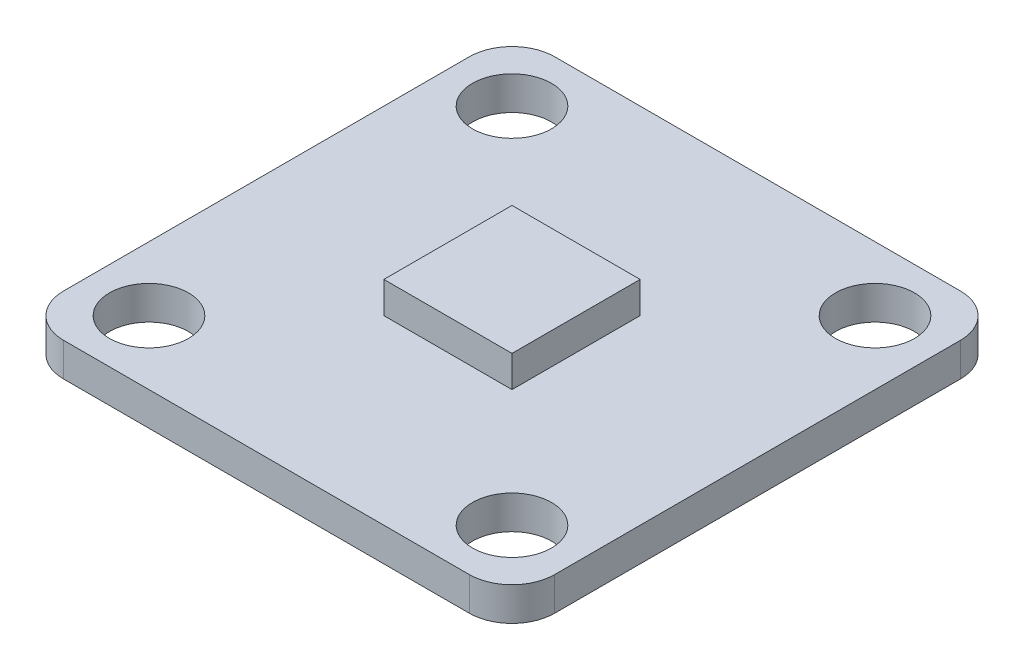
ISO-10303-21;
HEADER;
FILE_DESCRIPTION(('STEP AP214'),'2;1');
FILE_NAME('part.step','',(''),(''),'','','');
FILE_SCHEMA(('AUTOMOTIVE_DESIGN { 1 0 10303 214 1 1 1 1 }'));
ENDSEC;
DATA;
#1=APPLICATION_CONTEXT('core data for automotive mechanical design processes');
#2=APPLICATION_PROTOCOL_DEFINITION('international standard','automotive_design',2000,#1);
#3=PRODUCT_CONTEXT('',#1,'mechanical');
#4=PRODUCT('Part','Part','',(#3));
#5=PRODUCT_RELATED_PRODUCT_CATEGORY('part','',(#4));
#6=PRODUCT_DEFINITION_FORMATION('','',#4);
#7=PRODUCT_DEFINITION_CONTEXT('part definition',#1,'design');
#8=PRODUCT_DEFINITION('design','',#6,#7);
#9=PRODUCT_DEFINITION_SHAPE('','',#8);
#10=(LENGTH_UNIT() NAMED_UNIT(*) SI_UNIT(.MILLI.,.METRE.));
#11=(NAMED_UNIT(*) PLANE_ANGLE_UNIT() SI_UNIT($,.RADIAN.));
#12=(NAMED_UNIT(*) SI_UNIT($,.STERADIAN.) SOLID_ANGLE_UNIT());
#13=UNCERTAINTY_MEASURE_WITH_UNIT(LENGTH_MEASURE(1.E-05),#10,'distance_accuracy_value','');
#14=(GEOMETRIC_REPRESENTATION_CONTEXT(3) GLOBAL_UNCERTAINTY_ASSIGNED_CONTEXT((#13)) GLOBAL_UNIT_ASSIGNED_CONTEXT((#10,
#11,#12)) REPRESENTATION_CONTEXT('',''));
#15=CARTESIAN_POINT('',(0.,0.,0.));
#16=DIRECTION('',(0.,0.,1.));
#17=DIRECTION('',(1.,0.,0.));
#18=AXIS2_PLACEMENT_3D('',#15,#16,#17);
#19=CARTESIAN_POINT('',(0.,1.57,0.));
#20=DIRECTION('',(0.,1.,0.));
#21=DIRECTION('',(0.,0.,1.));
#22=AXIS2_PLACEMENT_3D('',#19,#20,#21);
#23=PLANE('',#22);
#24=CARTESIAN_POINT('',(-8.5,1.57,8.5));
#25=DIRECTION('',(0.,1.,0.));
#26=DIRECTION('',(0.,0.,1.));
#27=AXIS2_PLACEMENT_3D('',#24,#25,#26);
#28=CIRCLE('',#27,1.85);
#29=CARTESIAN_POINT('',(-8.5,1.57,10.35));
#30=VERTEX_POINT('',#29);
#31=EDGE_CURVE('E179',#30,#30,#28,.T.);
#32=ORIENTED_EDGE('',*,*,#31,.F.);
#33=EDGE_LOOP('',(#32));
#34=FACE_BOUND('',#33,.T.);
#35=CARTESIAN_POINT('',(8.5,1.57,8.5));
#36=DIRECTION('',(0.,1.,0.));
#37=DIRECTION('',(0.,0.,1.));
#38=AXIS2_PLACEMENT_3D('',#35,#36,#37);
#39=CIRCLE('',#38,1.85);
#40=CARTESIAN_POINT('',(8.5,1.57,10.35));
#41=VERTEX_POINT('',#40);
#42=EDGE_CURVE('E219',#41,#41,#39,.T.);
#43=ORIENTED_EDGE('',*,*,#42,.F.);
#44=EDGE_LOOP('',(#43));
#45=FACE_BOUND('',#44,.T.);
#46=CARTESIAN_POINT('',(8.5,1.57,-8.5));
#47=DIRECTION('',(0.,1.,0.));
#48=DIRECTION('',(0.,0.,1.));
#49=AXIS2_PLACEMENT_3D('',#46,#47,#48);
#50=CIRCLE('',#49,1.85);
#51=CARTESIAN_POINT('',(8.5,1.57,-6.65));
#52=VERTEX_POINT('',#51);
#53=EDGE_CURVE('E216',#52,#52,#50,.T.);
#54=ORIENTED_EDGE('',*,*,#53,.F.);
#55=EDGE_LOOP('',(#54));
#56=FACE_BOUND('',#55,.T.);
#57=CARTESIAN_POINT('',(-8.5,1.57,-8.5));
#58=DIRECTION('',(0.,1.,0.));
#59=DIRECTION('',(0.,0.,1.));
#60=AXIS2_PLACEMENT_3D('',#57,#58,#59);
#61=CIRCLE('',#60,1.85);
#62=CARTESIAN_POINT('',(-8.5,1.57,-6.65));
#63=VERTEX_POINT('',#62);
#64=EDGE_CURVE('E213',#63,#63,#61,.T.);
#65=ORIENTED_EDGE('',*,*,#64,.F.);
#66=EDGE_LOOP('',(#65));
#67=FACE_BOUND('',#66,.T.);
#68=CARTESIAN_POINT('',(-9.5,1.57,-9.5));
#69=DIRECTION('',(0.,1.,0.));
#70=DIRECTION('',(0.,0.,1.));
#71=AXIS2_PLACEMENT_3D('',#68,#69,#70);
#72=CIRCLE('',#71,2.);
#73=CARTESIAN_POINT('',(-11.5,1.57,-9.49999999999999));
#74=VERTEX_POINT('',#73);
#75=CARTESIAN_POINT('',(-9.49999999999999,1.57,-11.5));
#76=VERTEX_POINT('',#75);
#77=EDGE_CURVE('E209',#74,#76,#72,.F.);
#78=ORIENTED_EDGE('',*,*,#77,.F.);
#79=DIRECTION('',(0.,0.,-1.));
#80=VECTOR('',#79,1.);
#81=CARTESIAN_POINT('',(-11.5,1.57,0.));
#82=LINE('',#81,#80);
#83=CARTESIAN_POINT('',(-11.5,1.57,9.49999999999999));
#84=VERTEX_POINT('',#83);
#85=EDGE_CURVE('E207',#84,#74,#82,.T.);
#86=ORIENTED_EDGE('',*,*,#85,.F.);
#87=CARTESIAN_POINT('',(-9.5,1.57,9.5));
#88=DIRECTION('',(0.,1.,0.));
#89=DIRECTION('',(0.,0.,1.));
#90=AXIS2_PLACEMENT_3D('',#87,#88,#89);
#91=CIRCLE('',#90,2.);
#92=CARTESIAN_POINT('',(-9.49999999999999,1.57,11.5));
#93=VERTEX_POINT('',#92);
#94=EDGE_CURVE('E193',#93,#84,#91,.F.);
#95=ORIENTED_EDGE('',*,*,#94,.F.);
#96=DIRECTION('',(1.,0.,0.));
#97=VECTOR('',#96,1.);
#98=CARTESIAN_POINT('',(0.,1.57,11.5));
#99=LINE('',#98,#97);
#100=CARTESIAN_POINT('',(9.49999999999998,1.57,11.5));
#101=VERTEX_POINT('',#100);
#102=EDGE_CURVE('E205',#93,#101,#99,.T.);
#103=ORIENTED_EDGE('',*,*,#102,.T.);
#104=CARTESIAN_POINT('',(9.5,1.57,9.5));
#105=DIRECTION('',(0.,1.,0.));
#106=DIRECTION('',(0.,0.,1.));
#107=AXIS2_PLACEMENT_3D('',#104,#105,#106);
#108=CIRCLE('',#107,2.);
#109=CARTESIAN_POINT('',(11.5,1.57,9.49999999999999));
#110=VERTEX_POINT('',#109);
#111=EDGE_CURVE('E125',#101,#110,#108,.T.);
#112=ORIENTED_EDGE('',*,*,#111,.T.);
#113=DIRECTION('',(0.,0.,-1.));
#114=VECTOR('',#113,1.);
#115=CARTESIAN_POINT('',(11.5,1.57,0.));
#116=LINE('',#115,#114);
#117=CARTESIAN_POINT('',(11.5,1.57,-9.49999999999999));
#118=VERTEX_POINT('',#117);
#119=EDGE_CURVE('E118',#110,#118,#116,.T.);
#120=ORIENTED_EDGE('',*,*,#119,.T.);
#121=CARTESIAN_POINT('',(9.5,1.57,-9.5));
#122=DIRECTION('',(0.,1.,0.));
#123=DIRECTION('',(0.,0.,1.));
#124=AXIS2_PLACEMENT_3D('',#121,#122,#123);
#125=CIRCLE('',#124,2.);
#126=CARTESIAN_POINT('',(9.49999999999998,1.57,-11.5));
#127=VERTEX_POINT('',#126);
#128=EDGE_CURVE('E123',#127,#118,#125,.F.);
#129=ORIENTED_EDGE('',*,*,#128,.F.);
#130=DIRECTION('',(1.,0.,0.));
#131=VECTOR('',#130,1.);
#132=CARTESIAN_POINT('',(0.,1.57,-11.5));
#133=LINE('',#132,#131);
#134=EDGE_CURVE('E141',#76,#127,#133,.T.);
#135=ORIENTED_EDGE('',*,*,#134,.F.);
#136=EDGE_LOOP('',(#78,#86,#95,#103,#112,#120,#129,#135));
#137=FACE_BOUND('',#136,.T.);
#138=DIRECTION('',(0.,0.,1.));
#139=VECTOR('',#138,1.);
#140=CARTESIAN_POINT('',(-3.,1.57,0.));
#141=LINE('',#140,#139);
#142=CARTESIAN_POINT('',(-3.,1.57,-3.));
#143=VERTEX_POINT('',#142);
#144=CARTESIAN_POINT('',(-3.,1.57,3.));
#145=VERTEX_POINT('',#144);
#146=EDGE_CURVE('E239',#143,#145,#141,.T.);
#147=ORIENTED_EDGE('',*,*,#146,.F.);
#148=DIRECTION('',(-1.,0.,0.));
#149=VECTOR('',#148,1.);
#150=CARTESIAN_POINT('',(0.,1.57,-3.));
#151=LINE('',#150,#149);
#152=CARTESIAN_POINT('',(3.,1.57,-3.));
#153=VERTEX_POINT('',#152);
#154=EDGE_CURVE('E242',#153,#143,#151,.T.);
#155=ORIENTED_EDGE('',*,*,#154,.F.);
#156=DIRECTION('',(0.,0.,-1.));
#157=VECTOR('',#156,1.);
#158=CARTESIAN_POINT('',(3.,1.57,0.));
#159=LINE('',#158,#157);
#160=CARTESIAN_POINT('',(3.,1.57,3.));
#161=VERTEX_POINT('',#160);
#162=EDGE_CURVE('E234',#161,#153,#159,.T.);
#163=ORIENTED_EDGE('',*,*,#162,.F.);
#164=DIRECTION('',(1.,0.,0.));
#165=VECTOR('',#164,1.);
#166=CARTESIAN_POINT('',(0.,1.57,3.));
#167=LINE('',#166,#165);
#168=EDGE_CURVE('E237',#145,#161,#167,.T.);
#169=ORIENTED_EDGE('',*,*,#168,.F.);
#170=EDGE_LOOP('',(#147,#155,#163,#169));
#171=FACE_BOUND('',#170,.T.);
#172=ADVANCED_FACE('F40',(#34,#45,#56,#67,#137,#171),#23,.T.);
#173=CARTESIAN_POINT('',(-9.5,1.57,-9.5));
#174=DIRECTION('',(0.,-1.,0.));
#175=DIRECTION('',(0.,0.,-1.));
#176=AXIS2_PLACEMENT_3D('',#173,#174,#175);
#177=CYLINDRICAL_SURFACE('',#176,2.);
#178=CARTESIAN_POINT('',(-9.5,0.,-9.5));
#179=DIRECTION('',(0.,1.,0.));
#180=DIRECTION('',(0.,0.,1.));
#181=AXIS2_PLACEMENT_3D('',#178,#179,#180);
#182=CIRCLE('',#181,2.);
#183=CARTESIAN_POINT('',(-11.5,0.,-9.49999999999999));
#184=VERTEX_POINT('',#183);
#185=CARTESIAN_POINT('',(-9.49999999999999,0.,-11.5));
#186=VERTEX_POINT('',#185);
#187=EDGE_CURVE('E159',#184,#186,#182,.F.);
#188=ORIENTED_EDGE('',*,*,#187,.F.);
#189=DIRECTION('',(0.,-1.,0.));
#190=VECTOR('',#189,1.);
#191=CARTESIAN_POINT('',(-11.5,1.57,-9.49999999999999));
#192=LINE('',#191,#190);
#193=EDGE_CURVE('E11',#74,#184,#192,.T.);
#194=ORIENTED_EDGE('',*,*,#193,.F.);
#195=ORIENTED_EDGE('',*,*,#77,.T.);
#196=DIRECTION('',(0.,-1.,0.));
#197=VECTOR('',#196,1.);
#198=CARTESIAN_POINT('',(-9.49999999999999,1.57,-11.5));
#199=LINE('',#198,#197);
#200=EDGE_CURVE('E64',#76,#186,#199,.T.);
#201=ORIENTED_EDGE('',*,*,#200,.T.);
#202=EDGE_LOOP('',(#188,#194,#195,#201));
#203=FACE_BOUND('',#202,.T.);
#204=ADVANCED_FACE('F284',(#203),#177,.T.);
#205=CARTESIAN_POINT('',(-11.5,1.57,0.));
#206=DIRECTION('',(-1.,0.,0.));
#207=DIRECTION('',(0.,0.,1.));
#208=AXIS2_PLACEMENT_3D('',#205,#206,#207);
#209=PLANE('',#208);
#210=DIRECTION('',(0.,0.,-1.));
#211=VECTOR('',#210,1.);
#212=CARTESIAN_POINT('',(-11.5,0.,0.));
#213=LINE('',#212,#211);
#214=CARTESIAN_POINT('',(-11.5,0.,9.49999999999999));
#215=VERTEX_POINT('',#214);
#216=EDGE_CURVE('E161',#215,#184,#213,.T.);
#217=ORIENTED_EDGE('',*,*,#216,.F.);
#218=DIRECTION('',(0.,-1.,0.));
#219=VECTOR('',#218,1.);
#220=CARTESIAN_POINT('',(-11.5,1.57,9.49999999999999));
#221=LINE('',#220,#219);
#222=EDGE_CURVE('E48',#84,#215,#221,.T.);
#223=ORIENTED_EDGE('',*,*,#222,.F.);
#224=ORIENTED_EDGE('',*,*,#85,.T.);
#225=ORIENTED_EDGE('',*,*,#193,.T.);
#226=EDGE_LOOP('',(#217,#223,#224,#225));
#227=FACE_BOUND('',#226,.T.);
#228=ADVANCED_FACE('F197',(#227),#209,.T.);
#229=CARTESIAN_POINT('',(-9.5,1.57,9.5));
#230=DIRECTION('',(0.,-1.,0.));
#231=DIRECTION('',(0.,0.,-1.));
#232=AXIS2_PLACEMENT_3D('',#229,#230,#231);
#233=CYLINDRICAL_SURFACE('',#232,2.);
#234=CARTESIAN_POINT('',(-9.5,0.,9.5));
#235=DIRECTION('',(0.,1.,0.));
#236=DIRECTION('',(0.,0.,1.));
#237=AXIS2_PLACEMENT_3D('',#234,#235,#236);
#238=CIRCLE('',#237,2.);
#239=CARTESIAN_POINT('',(-9.49999999999999,0.,11.5));
#240=VERTEX_POINT('',#239);
#241=EDGE_CURVE('E164',#240,#215,#238,.F.);
#242=ORIENTED_EDGE('',*,*,#241,.F.);
#243=DIRECTION('',(0.,-1.,0.));
#244=VECTOR('',#243,1.);
#245=CARTESIAN_POINT('',(-9.49999999999999,1.57,11.5));
#246=LINE('',#245,#244);
#247=EDGE_CURVE('E186',#93,#240,#246,.T.);
#248=ORIENTED_EDGE('',*,*,#247,.F.);
#249=ORIENTED_EDGE('',*,*,#94,.T.);
#250=ORIENTED_EDGE('',*,*,#222,.T.);
#251=EDGE_LOOP('',(#242,#248,#249,#250));
#252=FACE_BOUND('',#251,.T.);
#253=ADVANCED_FACE('F191',(#252),#233,.T.);
#254=CARTESIAN_POINT('',(0.,1.57,11.5));
#255=DIRECTION('',(0.,0.,-1.));
#256=DIRECTION('',(-1.,0.,0.));
#257=AXIS2_PLACEMENT_3D('',#254,#255,#256);
#258=PLANE('',#257);
#259=DIRECTION('',(1.,0.,0.));
#260=VECTOR('',#259,1.);
#261=CARTESIAN_POINT('',(0.,0.,11.5));
#262=LINE('',#261,#260);
#263=CARTESIAN_POINT('',(9.49999999999998,0.,11.5));
#264=VERTEX_POINT('',#263);
#265=EDGE_CURVE('E167',#240,#264,#262,.T.);
#266=ORIENTED_EDGE('',*,*,#265,.T.);
#267=DIRECTION('',(0.,-1.,0.));
#268=VECTOR('',#267,1.);
#269=CARTESIAN_POINT('',(9.49999999999998,1.57,11.5));
#270=LINE('',#269,#268);
#271=EDGE_CURVE('E183',#101,#264,#270,.T.);
#272=ORIENTED_EDGE('',*,*,#271,.F.);
#273=ORIENTED_EDGE('',*,*,#102,.F.);
#274=ORIENTED_EDGE('',*,*,#247,.T.);
#275=EDGE_LOOP('',(#266,#272,#273,#274));
#276=FACE_BOUND('',#275,.T.);
#277=ADVANCED_FACE('F203',(#276),#258,.F.);
#278=CARTESIAN_POINT('',(9.5,1.57,9.5));
#279=DIRECTION('',(0.,-1.,0.));
#280=DIRECTION('',(0.,0.,-1.));
#281=AXIS2_PLACEMENT_3D('',#278,#279,#280);
#282=CYLINDRICAL_SURFACE('',#281,2.);
#283=CARTESIAN_POINT('',(9.5,0.,9.5));
#284=DIRECTION('',(0.,1.,0.));
#285=DIRECTION('',(0.,0.,1.));
#286=AXIS2_PLACEMENT_3D('',#283,#284,#285);
#287=CIRCLE('',#286,2.);
#288=CARTESIAN_POINT('',(11.5,0.,9.49999999999999));
#289=VERTEX_POINT('',#288);
#290=EDGE_CURVE('E170',#264,#289,#287,.T.);
#291=ORIENTED_EDGE('',*,*,#290,.T.);
#292=DIRECTION('',(0.,-1.,0.));
#293=VECTOR('',#292,1.);
#294=CARTESIAN_POINT('',(11.5,1.57,9.49999999999999));
#295=LINE('',#294,#293);
#296=EDGE_CURVE('E137',#110,#289,#295,.T.);
#297=ORIENTED_EDGE('',*,*,#296,.F.);
#298=ORIENTED_EDGE('',*,*,#111,.F.);
#299=ORIENTED_EDGE('',*,*,#271,.T.);
#300=EDGE_LOOP('',(#291,#297,#298,#299));
#301=FACE_BOUND('',#300,.T.);
#302=ADVANCED_FACE('F307',(#301),#282,.T.);
#303=CARTESIAN_POINT('',(11.5,1.57,0.));
#304=DIRECTION('',(-1.,0.,0.));
#305=DIRECTION('',(0.,0.,1.));
#306=AXIS2_PLACEMENT_3D('',#303,#304,#305);
#307=PLANE('',#306);
#308=DIRECTION('',(0.,0.,-1.));
#309=VECTOR('',#308,1.);
#310=CARTESIAN_POINT('',(11.5,0.,0.));
#311=LINE('',#310,#309);
#312=CARTESIAN_POINT('',(11.5,0.,-9.49999999999999));
#313=VERTEX_POINT('',#312);
#314=EDGE_CURVE('E133',#289,#313,#311,.T.);
#315=ORIENTED_EDGE('',*,*,#314,.T.);
#316=DIRECTION('',(0.,-1.,0.));
#317=VECTOR('',#316,1.);
#318=CARTESIAN_POINT('',(11.5,1.57,-9.49999999999999));
#319=LINE('',#318,#317);
#320=EDGE_CURVE('E131',#118,#313,#319,.T.);
#321=ORIENTED_EDGE('',*,*,#320,.F.);
#322=ORIENTED_EDGE('',*,*,#119,.F.);
#323=ORIENTED_EDGE('',*,*,#296,.T.);
#324=EDGE_LOOP('',(#315,#321,#322,#323));
#325=FACE_BOUND('',#324,.T.);
#326=ADVANCED_FACE('F132',(#325),#307,.F.);
#327=CARTESIAN_POINT('',(9.5,1.57,-9.5));
#328=DIRECTION('',(0.,-1.,0.));
#329=DIRECTION('',(0.,0.,-1.));
#330=AXIS2_PLACEMENT_3D('',#327,#328,#329);
#331=CYLINDRICAL_SURFACE('',#330,2.);
#332=CARTESIAN_POINT('',(9.5,0.,-9.5));
#333=DIRECTION('',(0.,1.,0.));
#334=DIRECTION('',(0.,0.,1.));
#335=AXIS2_PLACEMENT_3D('',#332,#333,#334);
#336=CIRCLE('',#335,2.);
#337=CARTESIAN_POINT('',(9.49999999999998,0.,-11.5));
#338=VERTEX_POINT('',#337);
#339=EDGE_CURVE('E174',#338,#313,#336,.F.);
#340=ORIENTED_EDGE('',*,*,#339,.F.);
#341=DIRECTION('',(0.,-1.,0.));
#342=VECTOR('',#341,1.);
#343=CARTESIAN_POINT('',(9.49999999999998,1.57,-11.5));
#344=LINE('',#343,#342);
#345=EDGE_CURVE('E138',#127,#338,#344,.T.);
#346=ORIENTED_EDGE('',*,*,#345,.F.);
#347=ORIENTED_EDGE('',*,*,#128,.T.);
#348=ORIENTED_EDGE('',*,*,#320,.T.);
#349=EDGE_LOOP('',(#340,#346,#347,#348));
#350=FACE_BOUND('',#349,.T.);
#351=ADVANCED_FACE('F140',(#350),#331,.T.);
#352=CARTESIAN_POINT('',(-8.5,1.57,-8.5));
#353=DIRECTION('',(0.,-1.,0.));
#354=DIRECTION('',(0.,0.,-1.));
#355=AXIS2_PLACEMENT_3D('',#352,#353,#354);
#356=CYLINDRICAL_SURFACE('',#355,1.85);
#357=ORIENTED_EDGE('',*,*,#64,.T.);
#358=EDGE_LOOP('',(#357));
#359=FACE_BOUND('',#358,.T.);
#360=CARTESIAN_POINT('',(-8.5,0.,-8.5));
#361=DIRECTION('',(0.,1.,0.));
#362=DIRECTION('',(0.,0.,1.));
#363=AXIS2_PLACEMENT_3D('',#360,#361,#362);
#364=CIRCLE('',#363,1.85);
#365=CARTESIAN_POINT('',(-8.5,0.,-6.65));
#366=VERTEX_POINT('',#365);
#367=EDGE_CURVE('E156',#366,#366,#364,.T.);
#368=ORIENTED_EDGE('',*,*,#367,.F.);
#369=EDGE_LOOP('',(#368));
#370=FACE_BOUND('',#369,.T.);
#371=ADVANCED_FACE('F304',(#359,#370),#356,.F.);
#372=CARTESIAN_POINT('',(8.5,1.57,-8.5));
#373=DIRECTION('',(0.,-1.,0.));
#374=DIRECTION('',(0.,0.,-1.));
#375=AXIS2_PLACEMENT_3D('',#372,#373,#374);
#376=CYLINDRICAL_SURFACE('',#375,1.85);
#377=ORIENTED_EDGE('',*,*,#53,.T.);
#378=EDGE_LOOP('',(#377));
#379=FACE_BOUND('',#378,.T.);
#380=CARTESIAN_POINT('',(8.5,0.,-8.5));
#381=DIRECTION('',(0.,1.,0.));
#382=DIRECTION('',(0.,0.,1.));
#383=AXIS2_PLACEMENT_3D('',#380,#381,#382);
#384=CIRCLE('',#383,1.85);
#385=CARTESIAN_POINT('',(8.5,0.,-6.65));
#386=VERTEX_POINT('',#385);
#387=EDGE_CURVE('E153',#386,#386,#384,.T.);
#388=ORIENTED_EDGE('',*,*,#387,.F.);
#389=EDGE_LOOP('',(#388));
#390=FACE_BOUND('',#389,.T.);
#391=ADVANCED_FACE('F319',(#379,#390),#376,.F.);
#392=CARTESIAN_POINT('',(8.5,1.57,8.5));
#393=DIRECTION('',(0.,-1.,0.));
#394=DIRECTION('',(0.,0.,-1.));
#395=AXIS2_PLACEMENT_3D('',#392,#393,#394);
#396=CYLINDRICAL_SURFACE('',#395,1.85);
#397=ORIENTED_EDGE('',*,*,#42,.T.);
#398=EDGE_LOOP('',(#397));
#399=FACE_BOUND('',#398,.T.);
#400=CARTESIAN_POINT('',(8.5,0.,8.5));
#401=DIRECTION('',(0.,1.,0.));
#402=DIRECTION('',(0.,0.,1.));
#403=AXIS2_PLACEMENT_3D('',#400,#401,#402);
#404=CIRCLE('',#403,1.85);
#405=CARTESIAN_POINT('',(8.5,0.,10.35));
#406=VERTEX_POINT('',#405);
#407=EDGE_CURVE('E149',#406,#406,#404,.T.);
#408=ORIENTED_EDGE('',*,*,#407,.F.);
#409=EDGE_LOOP('',(#408));
#410=FACE_BOUND('',#409,.T.);
#411=ADVANCED_FACE('F322',(#399,#410),#396,.F.);
#412=CARTESIAN_POINT('',(-8.5,1.57,8.5));
#413=DIRECTION('',(0.,-1.,0.));
#414=DIRECTION('',(0.,0.,-1.));
#415=AXIS2_PLACEMENT_3D('',#412,#413,#414);
#416=CYLINDRICAL_SURFACE('',#415,1.85);
#417=ORIENTED_EDGE('',*,*,#31,.T.);
#418=EDGE_LOOP('',(#417));
#419=FACE_BOUND('',#418,.T.);
#420=CARTESIAN_POINT('',(-8.5,0.,8.5));
#421=DIRECTION('',(0.,1.,0.));
#422=DIRECTION('',(0.,0.,1.));
#423=AXIS2_PLACEMENT_3D('',#420,#421,#422);
#424=CIRCLE('',#423,1.85);
#425=CARTESIAN_POINT('',(-8.5,0.,10.35));
#426=VERTEX_POINT('',#425);
#427=EDGE_CURVE('E146',#426,#426,#424,.T.);
#428=ORIENTED_EDGE('',*,*,#427,.F.);
#429=EDGE_LOOP('',(#428));
#430=FACE_BOUND('',#429,.T.);
#431=ADVANCED_FACE('F42',(#419,#430),#416,.F.);
#432=CARTESIAN_POINT('',(0.,1.57,-11.5));
#433=DIRECTION('',(0.,0.,-1.));
#434=DIRECTION('',(-1.,0.,0.));
#435=AXIS2_PLACEMENT_3D('',#432,#433,#434);
#436=PLANE('',#435);
#437=DIRECTION('',(1.,0.,0.));
#438=VECTOR('',#437,1.);
#439=CARTESIAN_POINT('',(0.,0.,-11.5));
#440=LINE('',#439,#438);
#441=EDGE_CURVE('E176',#186,#338,#440,.T.);
#442=ORIENTED_EDGE('',*,*,#441,.F.);
#443=ORIENTED_EDGE('',*,*,#200,.F.);
#444=ORIENTED_EDGE('',*,*,#134,.T.);
#445=ORIENTED_EDGE('',*,*,#345,.T.);
#446=EDGE_LOOP('',(#442,#443,#444,#445));
#447=FACE_BOUND('',#446,.T.);
#448=ADVANCED_FACE('F298',(#447),#436,.T.);
#449=CARTESIAN_POINT('',(0.,0.,0.));
#450=DIRECTION('',(0.,1.,0.));
#451=DIRECTION('',(0.,0.,1.));
#452=AXIS2_PLACEMENT_3D('',#449,#450,#451);
#453=PLANE('',#452);
#454=ORIENTED_EDGE('',*,*,#427,.T.);
#455=EDGE_LOOP('',(#454));
#456=FACE_BOUND('',#455,.T.);
#457=ORIENTED_EDGE('',*,*,#407,.T.);
#458=EDGE_LOOP('',(#457));
#459=FACE_BOUND('',#458,.T.);
#460=ORIENTED_EDGE('',*,*,#387,.T.);
#461=EDGE_LOOP('',(#460));
#462=FACE_BOUND('',#461,.T.);
#463=ORIENTED_EDGE('',*,*,#367,.T.);
#464=EDGE_LOOP('',(#463));
#465=FACE_BOUND('',#464,.T.);
#466=ORIENTED_EDGE('',*,*,#187,.T.);
#467=ORIENTED_EDGE('',*,*,#441,.T.);
#468=ORIENTED_EDGE('',*,*,#339,.T.);
#469=ORIENTED_EDGE('',*,*,#314,.F.);
#470=ORIENTED_EDGE('',*,*,#290,.F.);
#471=ORIENTED_EDGE('',*,*,#265,.F.);
#472=ORIENTED_EDGE('',*,*,#241,.T.);
#473=ORIENTED_EDGE('',*,*,#216,.T.);
#474=EDGE_LOOP('',(#466,#467,#468,#469,#470,#471,#472,#473));
#475=FACE_BOUND('',#474,.T.);
#476=ADVANCED_FACE('F200',(#456,#459,#462,#465,#475),#453,.F.);
#477=CARTESIAN_POINT('',(0.,3.04,-3.));
#478=DIRECTION('',(0.,0.,1.));
#479=DIRECTION('',(1.,0.,0.));
#480=AXIS2_PLACEMENT_3D('',#477,#478,#479);
#481=PLANE('',#480);
#482=ORIENTED_EDGE('',*,*,#154,.T.);
#483=DIRECTION('',(0.,-1.,0.));
#484=VECTOR('',#483,1.);
#485=CARTESIAN_POINT('',(-3.,3.04,-3.));
#486=LINE('',#485,#484);
#487=CARTESIAN_POINT('',(-3.,3.04,-3.));
#488=VERTEX_POINT('',#487);
#489=EDGE_CURVE('E150',#488,#143,#486,.T.);
#490=ORIENTED_EDGE('',*,*,#489,.F.);
#491=DIRECTION('',(-1.,0.,0.));
#492=VECTOR('',#491,1.);
#493=CARTESIAN_POINT('',(0.,3.04,-3.));
#494=LINE('',#493,#492);
#495=CARTESIAN_POINT('',(3.,3.04,-3.));
#496=VERTEX_POINT('',#495);
#497=EDGE_CURVE('E236',#496,#488,#494,.T.);
#498=ORIENTED_EDGE('',*,*,#497,.F.);
#499=DIRECTION('',(0.,-1.,0.));
#500=VECTOR('',#499,1.);
#501=CARTESIAN_POINT('',(3.,3.04,-3.));
#502=LINE('',#501,#500);
#503=EDGE_CURVE('E230',#496,#153,#502,.T.);
#504=ORIENTED_EDGE('',*,*,#503,.T.);
#505=EDGE_LOOP('',(#482,#490,#498,#504));
#506=FACE_BOUND('',#505,.T.);
#507=ADVANCED_FACE('F265',(#506),#481,.F.);
#508=CARTESIAN_POINT('',(-3.,3.04,0.));
#509=DIRECTION('',(1.,0.,0.));
#510=DIRECTION('',(0.,0.,-1.));
#511=AXIS2_PLACEMENT_3D('',#508,#509,#510);
#512=PLANE('',#511);
#513=ORIENTED_EDGE('',*,*,#146,.T.);
#514=DIRECTION('',(0.,-1.,0.));
#515=VECTOR('',#514,1.);
#516=CARTESIAN_POINT('',(-3.,3.04,3.));
#517=LINE('',#516,#515);
#518=CARTESIAN_POINT('',(-3.,3.04,3.));
#519=VERTEX_POINT('',#518);
#520=EDGE_CURVE('E226',#519,#145,#517,.T.);
#521=ORIENTED_EDGE('',*,*,#520,.F.);
#522=DIRECTION('',(0.,0.,1.));
#523=VECTOR('',#522,1.);
#524=CARTESIAN_POINT('',(-3.,3.04,0.));
#525=LINE('',#524,#523);
#526=EDGE_CURVE('E250',#488,#519,#525,.T.);
#527=ORIENTED_EDGE('',*,*,#526,.F.);
#528=ORIENTED_EDGE('',*,*,#489,.T.);
#529=EDGE_LOOP('',(#513,#521,#527,#528));
#530=FACE_BOUND('',#529,.T.);
#531=ADVANCED_FACE('F270',(#530),#512,.F.);
#532=CARTESIAN_POINT('',(0.,3.04,3.));
#533=DIRECTION('',(0.,0.,-1.));
#534=DIRECTION('',(-1.,0.,0.));
#535=AXIS2_PLACEMENT_3D('',#532,#533,#534);
#536=PLANE('',#535);
#537=ORIENTED_EDGE('',*,*,#168,.T.);
#538=DIRECTION('',(0.,-1.,0.));
#539=VECTOR('',#538,1.);
#540=CARTESIAN_POINT('',(3.,3.04,3.));
#541=LINE('',#540,#539);
#542=CARTESIAN_POINT('',(3.,3.04,3.));
#543=VERTEX_POINT('',#542);
#544=EDGE_CURVE('E55',#543,#161,#541,.T.);
#545=ORIENTED_EDGE('',*,*,#544,.F.);
#546=DIRECTION('',(1.,0.,0.));
#547=VECTOR('',#546,1.);
#548=CARTESIAN_POINT('',(0.,3.04,3.));
#549=LINE('',#548,#547);
#550=EDGE_CURVE('E247',#519,#543,#549,.T.);
#551=ORIENTED_EDGE('',*,*,#550,.F.);
#552=ORIENTED_EDGE('',*,*,#520,.T.);
#553=EDGE_LOOP('',(#537,#545,#551,#552));
#554=FACE_BOUND('',#553,.T.);
#555=ADVANCED_FACE('F279',(#554),#536,.F.);
#556=CARTESIAN_POINT('',(3.,3.04,0.));
#557=DIRECTION('',(-1.,0.,0.));
#558=DIRECTION('',(0.,0.,1.));
#559=AXIS2_PLACEMENT_3D('',#556,#557,#558);
#560=PLANE('',#559);
#561=ORIENTED_EDGE('',*,*,#162,.T.);
#562=ORIENTED_EDGE('',*,*,#503,.F.);
#563=DIRECTION('',(0.,0.,-1.));
#564=VECTOR('',#563,1.);
#565=CARTESIAN_POINT('',(3.,3.04,0.));
#566=LINE('',#565,#564);
#567=EDGE_CURVE('E233',#543,#496,#566,.T.);
#568=ORIENTED_EDGE('',*,*,#567,.F.);
#569=ORIENTED_EDGE('',*,*,#544,.T.);
#570=EDGE_LOOP('',(#561,#562,#568,#569));
#571=FACE_BOUND('',#570,.T.);
#572=ADVANCED_FACE('F282',(#571),#560,.F.);
#573=CARTESIAN_POINT('',(0.,3.04,0.));
#574=DIRECTION('',(0.,1.,0.));
#575=DIRECTION('',(0.,0.,1.));
#576=AXIS2_PLACEMENT_3D('',#573,#574,#575);
#577=PLANE('',#576);
#578=ORIENTED_EDGE('',*,*,#497,.T.);
#579=ORIENTED_EDGE('',*,*,#526,.T.);
#580=ORIENTED_EDGE('',*,*,#550,.T.);
#581=ORIENTED_EDGE('',*,*,#567,.T.);
#582=EDGE_LOOP('',(#578,#579,#580,#581));
#583=FACE_BOUND('',#582,.T.);
#584=ADVANCED_FACE('F258',(#583),#577,.T.);
#585=CLOSED_SHELL('',(#172,#204,#228,#253,#277,#302,#326,#351,#371,#391,#411,#431,#448,#476,
#507,#531,#555,#572,#584));
#586=MANIFOLD_SOLID_BREP('B2',#585);
#587=ADVANCED_BREP_SHAPE_REPRESENTATION('',(#18,#586),#14);
#588=SHAPE_DEFINITION_REPRESENTATION(#9,#587);
ENDSEC;
END-ISO-10303-21;
